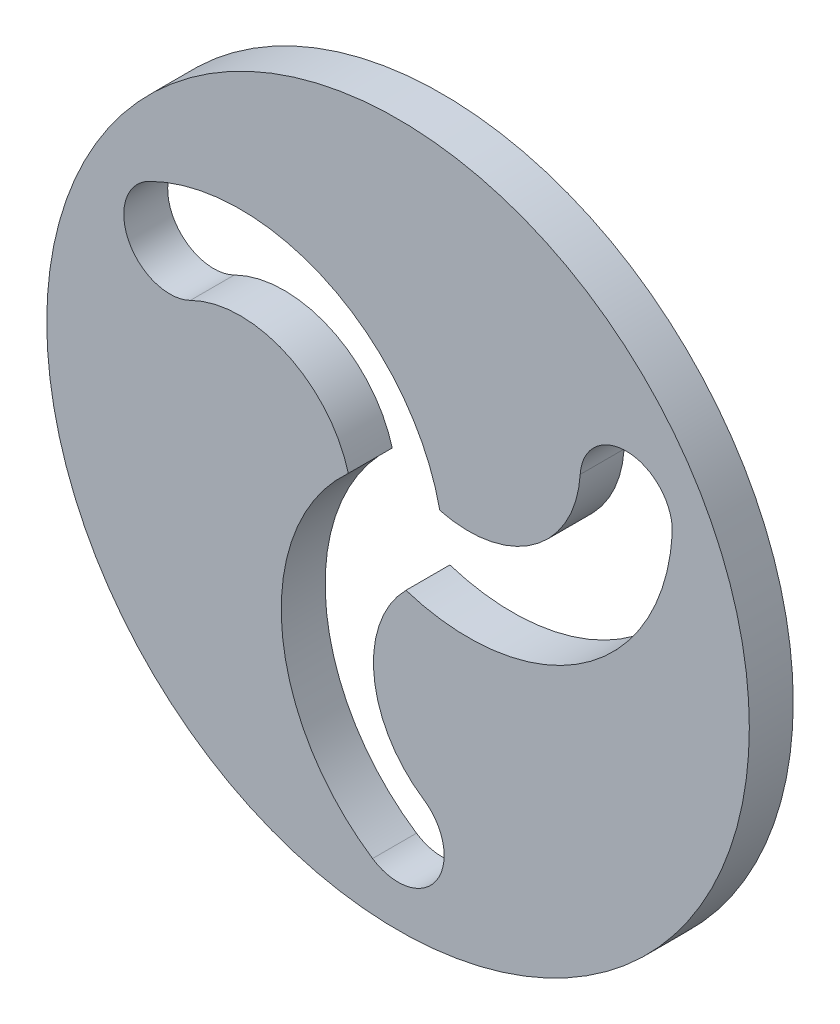
ISO-10303-21;
HEADER;
FILE_DESCRIPTION(('STEP AP214'),'2;1');
FILE_NAME('part.step','',(''),(''),'','','');
FILE_SCHEMA(('AUTOMOTIVE_DESIGN { 1 0 10303 214 1 1 1 1 }'));
ENDSEC;
DATA;
#1=APPLICATION_CONTEXT('core data for automotive mechanical design processes');
#2=APPLICATION_PROTOCOL_DEFINITION('international standard','automotive_design',2000,#1);
#3=PRODUCT_CONTEXT('',#1,'mechanical');
#4=PRODUCT('Part','Part','',(#3));
#5=PRODUCT_RELATED_PRODUCT_CATEGORY('part','',(#4));
#6=PRODUCT_DEFINITION_FORMATION('','',#4);
#7=PRODUCT_DEFINITION_CONTEXT('part definition',#1,'design');
#8=PRODUCT_DEFINITION('design','',#6,#7);
#9=PRODUCT_DEFINITION_SHAPE('','',#8);
#10=(LENGTH_UNIT() NAMED_UNIT(*) SI_UNIT(.MILLI.,.METRE.));
#11=(NAMED_UNIT(*) PLANE_ANGLE_UNIT() SI_UNIT($,.RADIAN.));
#12=(NAMED_UNIT(*) SI_UNIT($,.STERADIAN.) SOLID_ANGLE_UNIT());
#13=UNCERTAINTY_MEASURE_WITH_UNIT(LENGTH_MEASURE(1.E-05),#10,'distance_accuracy_value','');
#14=(GEOMETRIC_REPRESENTATION_CONTEXT(3) GLOBAL_UNCERTAINTY_ASSIGNED_CONTEXT((#13)) GLOBAL_UNIT_ASSIGNED_CONTEXT((#10,
#11,#12)) REPRESENTATION_CONTEXT('',''));
#15=CARTESIAN_POINT('',(0.,0.,0.));
#16=DIRECTION('',(0.,0.,1.));
#17=DIRECTION('',(1.,0.,0.));
#18=AXIS2_PLACEMENT_3D('',#15,#16,#17);
#19=CARTESIAN_POINT('',(0.,0.,5.));
#20=DIRECTION('',(0.,0.,-1.));
#21=DIRECTION('',(-1.,0.,0.));
#22=AXIS2_PLACEMENT_3D('',#19,#20,#21);
#23=CYLINDRICAL_SURFACE('',#22,40.);
#24=CARTESIAN_POINT('',(0.,0.,5.));
#25=DIRECTION('',(0.,0.,1.));
#26=DIRECTION('',(1.,0.,0.));
#27=AXIS2_PLACEMENT_3D('',#24,#25,#26);
#28=CIRCLE('',#27,40.);
#29=CARTESIAN_POINT('',(40.,0.,5.));
#30=VERTEX_POINT('',#29);
#31=EDGE_CURVE('E277',#30,#30,#28,.T.);
#32=ORIENTED_EDGE('',*,*,#31,.F.);
#33=EDGE_LOOP('',(#32));
#34=FACE_BOUND('',#33,.T.);
#35=CARTESIAN_POINT('',(0.,0.,0.));
#36=DIRECTION('',(0.,0.,1.));
#37=DIRECTION('',(1.,0.,0.));
#38=AXIS2_PLACEMENT_3D('',#35,#36,#37);
#39=CIRCLE('',#38,40.);
#40=CARTESIAN_POINT('',(40.,0.,0.));
#41=VERTEX_POINT('',#40);
#42=EDGE_CURVE('E249',#41,#41,#39,.T.);
#43=ORIENTED_EDGE('',*,*,#42,.T.);
#44=EDGE_LOOP('',(#43));
#45=FACE_BOUND('',#44,.T.);
#46=ADVANCED_FACE('F129',(#34,#45),#23,.T.);
#47=CARTESIAN_POINT('',(0.,0.,5.));
#48=DIRECTION('',(0.,0.,1.));
#49=DIRECTION('',(1.,0.,0.));
#50=AXIS2_PLACEMENT_3D('',#47,#48,#49);
#51=PLANE('',#50);
#52=CARTESIAN_POINT('',(-25.9807621135331,15.0000000000001,5.));
#53=DIRECTION('',(0.,0.,1.));
#54=DIRECTION('',(1.,0.,0.));
#55=AXIS2_PLACEMENT_3D('',#52,#53,#54);
#56=CIRCLE('',#55,5.25);
#57=CARTESIAN_POINT('',(-28.3185999093096,19.7007461578604,5.));
#58=VERTEX_POINT('',#57);
#59=CARTESIAN_POINT('',(-23.6429243177567,10.2992538421396,5.));
#60=VERTEX_POINT('',#59);
#61=EDGE_CURVE('E273',#58,#60,#56,.T.);
#62=ORIENTED_EDGE('',*,*,#61,.F.);
#63=CARTESIAN_POINT('',(-17.9653182422997,-1.11684396980705,5.));
#64=DIRECTION('',(0.,0.,1.));
#65=DIRECTION('',(1.,0.,0.));
#66=AXIS2_PLACEMENT_3D('',#63,#64,#65);
#67=CIRCLE('',#66,23.25);
#68=CARTESIAN_POINT('',(4.76118213621191,3.78914018686456,5.));
#69=VERTEX_POINT('',#68);
#70=EDGE_CURVE('E237',#58,#69,#67,.F.);
#71=ORIENTED_EDGE('',*,*,#70,.T.);
#72=CARTESIAN_POINT('',(8.01544387123347,16.116843969807,5.));
#73=DIRECTION('',(0.,0.,1.));
#74=DIRECTION('',(1.,0.,0.));
#75=AXIS2_PLACEMENT_3D('',#72,#73,#74);
#76=CIRCLE('',#75,12.75);
#77=CARTESIAN_POINT('',(20.7408776261957,15.3257461578604,5.));
#78=VERTEX_POINT('',#77);
#79=EDGE_CURVE('E228',#78,#69,#76,.F.);
#80=ORIENTED_EDGE('',*,*,#79,.F.);
#81=CARTESIAN_POINT('',(25.9807621135333,14.9999999999998,5.));
#82=DIRECTION('',(0.,0.,1.));
#83=DIRECTION('',(1.,0.,0.));
#84=AXIS2_PLACEMENT_3D('',#81,#82,#83);
#85=CIRCLE('',#84,5.25);
#86=CARTESIAN_POINT('',(31.2206466008706,14.6742538421396,5.));
#87=VERTEX_POINT('',#86);
#88=EDGE_CURVE('E217',#87,#78,#85,.T.);
#89=ORIENTED_EDGE('',*,*,#88,.F.);
#90=CARTESIAN_POINT('',(8.01544387123347,16.116843969807,5.));
#91=DIRECTION('',(0.,0.,1.));
#92=DIRECTION('',(1.,0.,0.));
#93=AXIS2_PLACEMENT_3D('',#90,#91,#92);
#94=CIRCLE('',#93,23.25);
#95=CARTESIAN_POINT('',(0.900900592219277,-6.01787477543645,5.));
#96=VERTEX_POINT('',#95);
#97=EDGE_CURVE('E224',#87,#96,#94,.F.);
#98=ORIENTED_EDGE('',*,*,#97,.T.);
#99=CARTESIAN_POINT('',(9.9498743710662,-15.,5.));
#100=DIRECTION('',(0.,0.,1.));
#101=DIRECTION('',(1.,0.,0.));
#102=AXIS2_PLACEMENT_3D('',#99,#100,#101);
#103=CIRCLE('',#102,12.75);
#104=CARTESIAN_POINT('',(2.90204669156098,-25.625,5.));
#105=VERTEX_POINT('',#104);
#106=EDGE_CURVE('E203',#105,#96,#103,.F.);
#107=ORIENTED_EDGE('',*,*,#106,.F.);
#108=CARTESIAN_POINT('',(0.,-30.,5.));
#109=DIRECTION('',(0.,0.,1.));
#110=DIRECTION('',(1.,0.,0.));
#111=AXIS2_PLACEMENT_3D('',#108,#109,#110);
#112=CIRCLE('',#111,5.25);
#113=CARTESIAN_POINT('',(-2.90204669156097,-34.375,5.));
#114=VERTEX_POINT('',#113);
#115=EDGE_CURVE('E212',#114,#105,#112,.T.);
#116=ORIENTED_EDGE('',*,*,#115,.F.);
#117=CARTESIAN_POINT('',(9.9498743710662,-15.,5.));
#118=DIRECTION('',(0.,0.,1.));
#119=DIRECTION('',(1.,0.,0.));
#120=AXIS2_PLACEMENT_3D('',#117,#118,#119);
#121=CIRCLE('',#120,23.25);
#122=CARTESIAN_POINT('',(-5.66208272843118,2.22873458857189,5.));
#123=VERTEX_POINT('',#122);
#124=EDGE_CURVE('E144',#114,#123,#121,.F.);
#125=ORIENTED_EDGE('',*,*,#124,.T.);
#126=CARTESIAN_POINT('',(-17.9653182422997,-1.11684396980705,5.));
#127=DIRECTION('',(0.,0.,1.));
#128=DIRECTION('',(1.,0.,0.));
#129=AXIS2_PLACEMENT_3D('',#126,#127,#128);
#130=CIRCLE('',#129,12.75);
#131=EDGE_CURVE('E241',#60,#123,#130,.F.);
#132=ORIENTED_EDGE('',*,*,#131,.F.);
#133=EDGE_LOOP('',(#62,#71,#80,#89,#98,#107,#116,#125,#132));
#134=FACE_BOUND('',#133,.T.);
#135=ORIENTED_EDGE('',*,*,#31,.T.);
#136=EDGE_LOOP('',(#135));
#137=FACE_BOUND('',#136,.T.);
#138=ADVANCED_FACE('F220',(#134,#137),#51,.T.);
#139=CARTESIAN_POINT('',(0.,0.,0.));
#140=DIRECTION('',(0.,0.,1.));
#141=DIRECTION('',(1.,0.,0.));
#142=AXIS2_PLACEMENT_3D('',#139,#140,#141);
#143=PLANE('',#142);
#144=CARTESIAN_POINT('',(25.9807621135312,-15.0000000000011,0.));
#145=DIRECTION('',(0.,0.,1.));
#146=DIRECTION('',(1.,0.,0.));
#147=AXIS2_PLACEMENT_3D('',#144,#145,#146);
#148=CIRCLE('',#147,5.00000000000243);
#149=CARTESIAN_POINT('',(30.9807621135337,-15.0000000000011,0.));
#150=VERTEX_POINT('',#149);
#151=EDGE_CURVE('E12',#150,#150,#148,.F.);
#152=ORIENTED_EDGE('',*,*,#151,.F.);
#153=EDGE_LOOP('',(#152));
#154=FACE_BOUND('',#153,.T.);
#155=CARTESIAN_POINT('',(-25.9807621135351,-14.9999999999989,0.));
#156=DIRECTION('',(0.,0.,1.));
#157=DIRECTION('',(1.,0.,0.));
#158=AXIS2_PLACEMENT_3D('',#155,#156,#157);
#159=CIRCLE('',#158,5.00000000000164);
#160=CARTESIAN_POINT('',(-20.9807621135334,-14.9999999999989,0.));
#161=VERTEX_POINT('',#160);
#162=EDGE_CURVE('E137',#161,#161,#159,.F.);
#163=ORIENTED_EDGE('',*,*,#162,.F.);
#164=EDGE_LOOP('',(#163));
#165=FACE_BOUND('',#164,.T.);
#166=CARTESIAN_POINT('',(0.,30.,0.));
#167=DIRECTION('',(0.,0.,1.));
#168=DIRECTION('',(1.,0.,0.));
#169=AXIS2_PLACEMENT_3D('',#166,#167,#168);
#170=CIRCLE('',#169,5.);
#171=CARTESIAN_POINT('',(5.,30.,0.));
#172=VERTEX_POINT('',#171);
#173=EDGE_CURVE('E314',#172,#172,#170,.F.);
#174=ORIENTED_EDGE('',*,*,#173,.F.);
#175=EDGE_LOOP('',(#174));
#176=FACE_BOUND('',#175,.T.);
#177=CARTESIAN_POINT('',(-17.9653182422997,-1.11684396980705,0.));
#178=DIRECTION('',(0.,0.,1.));
#179=DIRECTION('',(1.,0.,0.));
#180=AXIS2_PLACEMENT_3D('',#177,#178,#179);
#181=CIRCLE('',#180,23.25);
#182=CARTESIAN_POINT('',(-28.3185999093096,19.7007461578604,0.));
#183=VERTEX_POINT('',#182);
#184=CARTESIAN_POINT('',(4.76118213621191,3.78914018686456,0.));
#185=VERTEX_POINT('',#184);
#186=EDGE_CURVE('E303',#183,#185,#181,.F.);
#187=ORIENTED_EDGE('',*,*,#186,.F.);
#188=CARTESIAN_POINT('',(-25.9807621135331,15.0000000000001,0.));
#189=DIRECTION('',(0.,0.,1.));
#190=DIRECTION('',(1.,0.,0.));
#191=AXIS2_PLACEMENT_3D('',#188,#189,#190);
#192=CIRCLE('',#191,5.25);
#193=CARTESIAN_POINT('',(-23.6429243177567,10.2992538421396,0.));
#194=VERTEX_POINT('',#193);
#195=EDGE_CURVE('E310',#183,#194,#192,.T.);
#196=ORIENTED_EDGE('',*,*,#195,.T.);
#197=CARTESIAN_POINT('',(-17.9653182422997,-1.11684396980705,0.));
#198=DIRECTION('',(0.,0.,1.));
#199=DIRECTION('',(1.,0.,0.));
#200=AXIS2_PLACEMENT_3D('',#197,#198,#199);
#201=CIRCLE('',#200,12.75);
#202=CARTESIAN_POINT('',(-5.66208272843118,2.22873458857189,0.));
#203=VERTEX_POINT('',#202);
#204=EDGE_CURVE('E306',#194,#203,#201,.F.);
#205=ORIENTED_EDGE('',*,*,#204,.T.);
#206=CARTESIAN_POINT('',(9.9498743710662,-15.,0.));
#207=DIRECTION('',(0.,0.,1.));
#208=DIRECTION('',(1.,0.,0.));
#209=AXIS2_PLACEMENT_3D('',#206,#207,#208);
#210=CIRCLE('',#209,23.25);
#211=CARTESIAN_POINT('',(-2.90204669156097,-34.375,0.));
#212=VERTEX_POINT('',#211);
#213=EDGE_CURVE('E292',#212,#203,#210,.F.);
#214=ORIENTED_EDGE('',*,*,#213,.F.);
#215=CARTESIAN_POINT('',(0.,-30.,0.));
#216=DIRECTION('',(0.,0.,1.));
#217=DIRECTION('',(1.,0.,0.));
#218=AXIS2_PLACEMENT_3D('',#215,#216,#217);
#219=CIRCLE('',#218,5.25);
#220=CARTESIAN_POINT('',(2.90204669156098,-25.625,0.));
#221=VERTEX_POINT('',#220);
#222=EDGE_CURVE('E281',#212,#221,#219,.T.);
#223=ORIENTED_EDGE('',*,*,#222,.T.);
#224=CARTESIAN_POINT('',(9.9498743710662,-15.,0.));
#225=DIRECTION('',(0.,0.,1.));
#226=DIRECTION('',(1.,0.,0.));
#227=AXIS2_PLACEMENT_3D('',#224,#225,#226);
#228=CIRCLE('',#227,12.75);
#229=CARTESIAN_POINT('',(0.900900592219277,-6.01787477543645,0.));
#230=VERTEX_POINT('',#229);
#231=EDGE_CURVE('E206',#221,#230,#228,.F.);
#232=ORIENTED_EDGE('',*,*,#231,.T.);
#233=CARTESIAN_POINT('',(8.01544387123347,16.116843969807,0.));
#234=DIRECTION('',(0.,0.,1.));
#235=DIRECTION('',(1.,0.,0.));
#236=AXIS2_PLACEMENT_3D('',#233,#234,#235);
#237=CIRCLE('',#236,23.25);
#238=CARTESIAN_POINT('',(31.2206466008706,14.6742538421396,0.));
#239=VERTEX_POINT('',#238);
#240=EDGE_CURVE('E289',#239,#230,#237,.F.);
#241=ORIENTED_EDGE('',*,*,#240,.F.);
#242=CARTESIAN_POINT('',(25.9807621135333,14.9999999999998,0.));
#243=DIRECTION('',(0.,0.,1.));
#244=DIRECTION('',(1.,0.,0.));
#245=AXIS2_PLACEMENT_3D('',#242,#243,#244);
#246=CIRCLE('',#245,5.25);
#247=CARTESIAN_POINT('',(20.7408776261957,15.3257461578604,0.));
#248=VERTEX_POINT('',#247);
#249=EDGE_CURVE('E295',#239,#248,#246,.T.);
#250=ORIENTED_EDGE('',*,*,#249,.T.);
#251=CARTESIAN_POINT('',(8.01544387123347,16.116843969807,0.));
#252=DIRECTION('',(0.,0.,1.));
#253=DIRECTION('',(1.,0.,0.));
#254=AXIS2_PLACEMENT_3D('',#251,#252,#253);
#255=CIRCLE('',#254,12.75);
#256=EDGE_CURVE('E299',#248,#185,#255,.F.);
#257=ORIENTED_EDGE('',*,*,#256,.T.);
#258=EDGE_LOOP('',(#187,#196,#205,#214,#223,#232,#241,#250,#257));
#259=FACE_BOUND('',#258,.T.);
#260=ORIENTED_EDGE('',*,*,#42,.F.);
#261=EDGE_LOOP('',(#260));
#262=FACE_BOUND('',#261,.T.);
#263=ADVANCED_FACE('F323',(#154,#165,#176,#259,#262),#143,.F.);
#264=CARTESIAN_POINT('',(9.9498743710662,-15.,-5.));
#265=DIRECTION('',(0.,0.,1.));
#266=DIRECTION('',(1.,0.,0.));
#267=AXIS2_PLACEMENT_3D('',#264,#265,#266);
#268=CYLINDRICAL_SURFACE('',#267,23.25);
#269=ORIENTED_EDGE('',*,*,#213,.T.);
#270=DIRECTION('',(0.,0.,1.));
#271=VECTOR('',#270,1.);
#272=CARTESIAN_POINT('',(-5.66208272843118,2.22873458857189,-5.));
#273=LINE('',#272,#271);
#274=EDGE_CURVE('E250',#203,#123,#273,.T.);
#275=ORIENTED_EDGE('',*,*,#274,.T.);
#276=ORIENTED_EDGE('',*,*,#124,.F.);
#277=DIRECTION('',(0.,0.,1.));
#278=VECTOR('',#277,1.);
#279=CARTESIAN_POINT('',(-2.90204669156097,-34.375,-5.));
#280=LINE('',#279,#278);
#281=EDGE_CURVE('E214',#212,#114,#280,.T.);
#282=ORIENTED_EDGE('',*,*,#281,.F.);
#283=EDGE_LOOP('',(#269,#275,#276,#282));
#284=FACE_BOUND('',#283,.T.);
#285=ADVANCED_FACE('F326',(#284),#268,.F.);
#286=CARTESIAN_POINT('',(-17.9653182422997,-1.11684396980705,-5.));
#287=DIRECTION('',(0.,0.,1.));
#288=DIRECTION('',(1.,0.,0.));
#289=AXIS2_PLACEMENT_3D('',#286,#287,#288);
#290=CYLINDRICAL_SURFACE('',#289,12.75);
#291=DIRECTION('',(0.,0.,1.));
#292=VECTOR('',#291,1.);
#293=CARTESIAN_POINT('',(-23.6429243177567,10.2992538421396,-5.));
#294=LINE('',#293,#292);
#295=EDGE_CURVE('E253',#194,#60,#294,.T.);
#296=ORIENTED_EDGE('',*,*,#295,.T.);
#297=ORIENTED_EDGE('',*,*,#131,.T.);
#298=ORIENTED_EDGE('',*,*,#274,.F.);
#299=ORIENTED_EDGE('',*,*,#204,.F.);
#300=EDGE_LOOP('',(#296,#297,#298,#299));
#301=FACE_BOUND('',#300,.T.);
#302=ADVANCED_FACE('F368',(#301),#290,.T.);
#303=CARTESIAN_POINT('',(-17.9653182422997,-1.11684396980705,-5.));
#304=DIRECTION('',(0.,0.,1.));
#305=DIRECTION('',(1.,0.,0.));
#306=AXIS2_PLACEMENT_3D('',#303,#304,#305);
#307=CYLINDRICAL_SURFACE('',#306,23.25);
#308=ORIENTED_EDGE('',*,*,#186,.T.);
#309=DIRECTION('',(0.,0.,1.));
#310=VECTOR('',#309,1.);
#311=CARTESIAN_POINT('',(4.76118213621191,3.78914018686456,-5.));
#312=LINE('',#311,#310);
#313=EDGE_CURVE('E259',#185,#69,#312,.T.);
#314=ORIENTED_EDGE('',*,*,#313,.T.);
#315=ORIENTED_EDGE('',*,*,#70,.F.);
#316=DIRECTION('',(0.,0.,1.));
#317=VECTOR('',#316,1.);
#318=CARTESIAN_POINT('',(-28.3185999093096,19.7007461578604,-5.));
#319=LINE('',#318,#317);
#320=EDGE_CURVE('E256',#183,#58,#319,.T.);
#321=ORIENTED_EDGE('',*,*,#320,.F.);
#322=EDGE_LOOP('',(#308,#314,#315,#321));
#323=FACE_BOUND('',#322,.T.);
#324=ADVANCED_FACE('F364',(#323),#307,.F.);
#325=CARTESIAN_POINT('',(8.01544387123347,16.116843969807,-5.));
#326=DIRECTION('',(0.,0.,1.));
#327=DIRECTION('',(1.,0.,0.));
#328=AXIS2_PLACEMENT_3D('',#325,#326,#327);
#329=CYLINDRICAL_SURFACE('',#328,12.75);
#330=DIRECTION('',(0.,0.,1.));
#331=VECTOR('',#330,1.);
#332=CARTESIAN_POINT('',(20.7408776261957,15.3257461578604,-5.));
#333=LINE('',#332,#331);
#334=EDGE_CURVE('E262',#248,#78,#333,.T.);
#335=ORIENTED_EDGE('',*,*,#334,.T.);
#336=ORIENTED_EDGE('',*,*,#79,.T.);
#337=ORIENTED_EDGE('',*,*,#313,.F.);
#338=ORIENTED_EDGE('',*,*,#256,.F.);
#339=EDGE_LOOP('',(#335,#336,#337,#338));
#340=FACE_BOUND('',#339,.T.);
#341=ADVANCED_FACE('F360',(#340),#329,.T.);
#342=CARTESIAN_POINT('',(8.01544387123347,16.116843969807,-5.));
#343=DIRECTION('',(0.,0.,1.));
#344=DIRECTION('',(1.,0.,0.));
#345=AXIS2_PLACEMENT_3D('',#342,#343,#344);
#346=CYLINDRICAL_SURFACE('',#345,23.25);
#347=ORIENTED_EDGE('',*,*,#240,.T.);
#348=DIRECTION('',(0.,0.,1.));
#349=VECTOR('',#348,1.);
#350=CARTESIAN_POINT('',(0.900900592219277,-6.01787477543645,-5.));
#351=LINE('',#350,#349);
#352=EDGE_CURVE('E209',#230,#96,#351,.T.);
#353=ORIENTED_EDGE('',*,*,#352,.T.);
#354=ORIENTED_EDGE('',*,*,#97,.F.);
#355=DIRECTION('',(0.,0.,1.));
#356=VECTOR('',#355,1.);
#357=CARTESIAN_POINT('',(31.2206466008706,14.6742538421396,-5.));
#358=LINE('',#357,#356);
#359=EDGE_CURVE('E265',#239,#87,#358,.T.);
#360=ORIENTED_EDGE('',*,*,#359,.F.);
#361=EDGE_LOOP('',(#347,#353,#354,#360));
#362=FACE_BOUND('',#361,.T.);
#363=ADVANCED_FACE('F357',(#362),#346,.F.);
#364=CARTESIAN_POINT('',(9.9498743710662,-15.,-5.));
#365=DIRECTION('',(0.,0.,1.));
#366=DIRECTION('',(1.,0.,0.));
#367=AXIS2_PLACEMENT_3D('',#364,#365,#366);
#368=CYLINDRICAL_SURFACE('',#367,12.75);
#369=DIRECTION('',(0.,0.,1.));
#370=VECTOR('',#369,1.);
#371=CARTESIAN_POINT('',(2.90204669156098,-25.625,-5.));
#372=LINE('',#371,#370);
#373=EDGE_CURVE('E152',#221,#105,#372,.T.);
#374=ORIENTED_EDGE('',*,*,#373,.T.);
#375=ORIENTED_EDGE('',*,*,#106,.T.);
#376=ORIENTED_EDGE('',*,*,#352,.F.);
#377=ORIENTED_EDGE('',*,*,#231,.F.);
#378=EDGE_LOOP('',(#374,#375,#376,#377));
#379=FACE_BOUND('',#378,.T.);
#380=ADVANCED_FACE('F200',(#379),#368,.T.);
#381=CARTESIAN_POINT('',(-25.9807621135331,15.0000000000001,-5.));
#382=DIRECTION('',(0.,0.,1.));
#383=DIRECTION('',(1.,0.,0.));
#384=AXIS2_PLACEMENT_3D('',#381,#382,#383);
#385=CYLINDRICAL_SURFACE('',#384,5.25);
#386=ORIENTED_EDGE('',*,*,#320,.T.);
#387=ORIENTED_EDGE('',*,*,#61,.T.);
#388=ORIENTED_EDGE('',*,*,#295,.F.);
#389=ORIENTED_EDGE('',*,*,#195,.F.);
#390=EDGE_LOOP('',(#386,#387,#388,#389));
#391=FACE_BOUND('',#390,.T.);
#392=ADVANCED_FACE('F344',(#391),#385,.F.);
#393=CARTESIAN_POINT('',(25.9807621135333,14.9999999999998,-5.));
#394=DIRECTION('',(0.,0.,1.));
#395=DIRECTION('',(1.,0.,0.));
#396=AXIS2_PLACEMENT_3D('',#393,#394,#395);
#397=CYLINDRICAL_SURFACE('',#396,5.25);
#398=ORIENTED_EDGE('',*,*,#359,.T.);
#399=ORIENTED_EDGE('',*,*,#88,.T.);
#400=ORIENTED_EDGE('',*,*,#334,.F.);
#401=ORIENTED_EDGE('',*,*,#249,.F.);
#402=EDGE_LOOP('',(#398,#399,#400,#401));
#403=FACE_BOUND('',#402,.T.);
#404=ADVANCED_FACE('F347',(#403),#397,.F.);
#405=CARTESIAN_POINT('',(0.,-30.,-5.));
#406=DIRECTION('',(0.,0.,1.));
#407=DIRECTION('',(1.,0.,0.));
#408=AXIS2_PLACEMENT_3D('',#405,#406,#407);
#409=CYLINDRICAL_SURFACE('',#408,5.25);
#410=ORIENTED_EDGE('',*,*,#281,.T.);
#411=ORIENTED_EDGE('',*,*,#115,.T.);
#412=ORIENTED_EDGE('',*,*,#373,.F.);
#413=ORIENTED_EDGE('',*,*,#222,.F.);
#414=EDGE_LOOP('',(#410,#411,#412,#413));
#415=FACE_BOUND('',#414,.T.);
#416=ADVANCED_FACE('F213',(#415),#409,.F.);
#417=CARTESIAN_POINT('',(0.,30.,-2.));
#418=DIRECTION('',(0.,0.,1.));
#419=DIRECTION('',(1.,0.,0.));
#420=AXIS2_PLACEMENT_3D('',#417,#418,#419);
#421=CYLINDRICAL_SURFACE('',#420,5.);
#422=CARTESIAN_POINT('',(0.,30.,-2.));
#423=DIRECTION('',(0.,0.,-1.));
#424=DIRECTION('',(-1.,0.,0.));
#425=AXIS2_PLACEMENT_3D('',#422,#423,#424);
#426=CIRCLE('',#425,5.);
#427=CARTESIAN_POINT('',(-5.,30.,-2.));
#428=VERTEX_POINT('',#427);
#429=EDGE_CURVE('E231',#428,#428,#426,.T.);
#430=ORIENTED_EDGE('',*,*,#429,.F.);
#431=EDGE_LOOP('',(#430));
#432=FACE_BOUND('',#431,.T.);
#433=ORIENTED_EDGE('',*,*,#173,.T.);
#434=EDGE_LOOP('',(#433));
#435=FACE_BOUND('',#434,.T.);
#436=ADVANCED_FACE('F354',(#432,#435),#421,.T.);
#437=CARTESIAN_POINT('',(0.,30.,-2.));
#438=DIRECTION('',(0.,0.,-1.));
#439=DIRECTION('',(-1.,0.,0.));
#440=AXIS2_PLACEMENT_3D('',#437,#438,#439);
#441=PLANE('',#440);
#442=ORIENTED_EDGE('',*,*,#429,.T.);
#443=EDGE_LOOP('',(#442));
#444=FACE_BOUND('',#443,.T.);
#445=ADVANCED_FACE('F377',(#444),#441,.T.);
#446=CARTESIAN_POINT('',(-25.9807621135351,-14.9999999999989,-2.));
#447=DIRECTION('',(0.,0.,1.));
#448=DIRECTION('',(1.,0.,0.));
#449=AXIS2_PLACEMENT_3D('',#446,#447,#448);
#450=CYLINDRICAL_SURFACE('',#449,5.00000000000164);
#451=CARTESIAN_POINT('',(-25.9807621135351,-14.9999999999989,-2.));
#452=DIRECTION('',(0.,0.,-1.));
#453=DIRECTION('',(-1.,0.,0.));
#454=AXIS2_PLACEMENT_3D('',#451,#452,#453);
#455=CIRCLE('',#454,5.00000000000164);
#456=CARTESIAN_POINT('',(-30.9807621135367,-14.9999999999989,-2.));
#457=VERTEX_POINT('',#456);
#458=EDGE_CURVE('E402',#457,#457,#455,.T.);
#459=ORIENTED_EDGE('',*,*,#458,.F.);
#460=EDGE_LOOP('',(#459));
#461=FACE_BOUND('',#460,.T.);
#462=ORIENTED_EDGE('',*,*,#162,.T.);
#463=EDGE_LOOP('',(#462));
#464=FACE_BOUND('',#463,.T.);
#465=ADVANCED_FACE('F321',(#461,#464),#450,.T.);
#466=CARTESIAN_POINT('',(-25.9807621135351,-14.9999999999989,-2.));
#467=DIRECTION('',(0.,0.,-1.));
#468=DIRECTION('',(-1.,0.,0.));
#469=AXIS2_PLACEMENT_3D('',#466,#467,#468);
#470=PLANE('',#469);
#471=ORIENTED_EDGE('',*,*,#458,.T.);
#472=EDGE_LOOP('',(#471));
#473=FACE_BOUND('',#472,.T.);
#474=ADVANCED_FACE('F384',(#473),#470,.T.);
#475=CARTESIAN_POINT('',(25.9807621135312,-15.0000000000011,-2.));
#476=DIRECTION('',(0.,0.,1.));
#477=DIRECTION('',(1.,0.,0.));
#478=AXIS2_PLACEMENT_3D('',#475,#476,#477);
#479=CYLINDRICAL_SURFACE('',#478,5.00000000000243);
#480=CARTESIAN_POINT('',(25.9807621135312,-15.0000000000011,-2.));
#481=DIRECTION('',(0.,0.,-1.));
#482=DIRECTION('',(-1.,0.,0.));
#483=AXIS2_PLACEMENT_3D('',#480,#481,#482);
#484=CIRCLE('',#483,5.00000000000243);
#485=CARTESIAN_POINT('',(20.9807621135288,-15.0000000000011,-2.));
#486=VERTEX_POINT('',#485);
#487=EDGE_CURVE('E400',#486,#486,#484,.T.);
#488=ORIENTED_EDGE('',*,*,#487,.F.);
#489=EDGE_LOOP('',(#488));
#490=FACE_BOUND('',#489,.T.);
#491=ORIENTED_EDGE('',*,*,#151,.T.);
#492=EDGE_LOOP('',(#491));
#493=FACE_BOUND('',#492,.T.);
#494=ADVANCED_FACE('F388',(#490,#493),#479,.T.);
#495=CARTESIAN_POINT('',(25.9807621135312,-15.0000000000011,-2.));
#496=DIRECTION('',(0.,0.,-1.));
#497=DIRECTION('',(-1.,0.,0.));
#498=AXIS2_PLACEMENT_3D('',#495,#496,#497);
#499=PLANE('',#498);
#500=ORIENTED_EDGE('',*,*,#487,.T.);
#501=EDGE_LOOP('',(#500));
#502=FACE_BOUND('',#501,.T.);
#503=ADVANCED_FACE('F392',(#502),#499,.T.);
#504=CLOSED_SHELL('',(#46,#138,#263,#285,#302,#324,#341,#363,#380,#392,#404,#416,#436,#445,#465,
#474,#494,#503));
#505=MANIFOLD_SOLID_BREP('B2',#504);
#506=ADVANCED_BREP_SHAPE_REPRESENTATION('',(#18,#505),#14);
#507=SHAPE_DEFINITION_REPRESENTATION(#9,#506);
ENDSEC;
END-ISO-10303-21;
